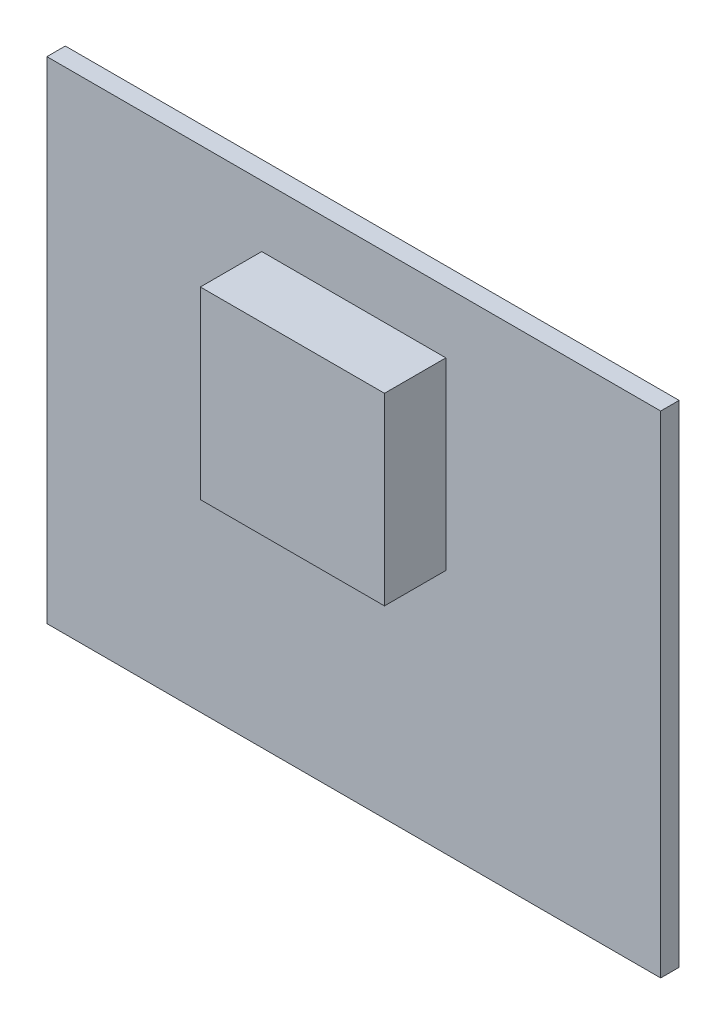
ISO-10303-21;
HEADER;
FILE_DESCRIPTION(('STEP AP214'),'2;1');
FILE_NAME('part.step','',(''),(''),'','','');
FILE_SCHEMA(('AUTOMOTIVE_DESIGN { 1 0 10303 214 1 1 1 1 }'));
ENDSEC;
DATA;
#1=APPLICATION_CONTEXT('core data for automotive mechanical design processes');
#2=APPLICATION_PROTOCOL_DEFINITION('international standard','automotive_design',2000,#1);
#3=PRODUCT_CONTEXT('',#1,'mechanical');
#4=PRODUCT('Part','Part','',(#3));
#5=PRODUCT_RELATED_PRODUCT_CATEGORY('part','',(#4));
#6=PRODUCT_DEFINITION_FORMATION('','',#4);
#7=PRODUCT_DEFINITION_CONTEXT('part definition',#1,'design');
#8=PRODUCT_DEFINITION('design','',#6,#7);
#9=PRODUCT_DEFINITION_SHAPE('','',#8);
#10=(LENGTH_UNIT() NAMED_UNIT(*) SI_UNIT(.MILLI.,.METRE.));
#11=(NAMED_UNIT(*) PLANE_ANGLE_UNIT() SI_UNIT($,.RADIAN.));
#12=(NAMED_UNIT(*) SI_UNIT($,.STERADIAN.) SOLID_ANGLE_UNIT());
#13=UNCERTAINTY_MEASURE_WITH_UNIT(LENGTH_MEASURE(1.E-05),#10,'distance_accuracy_value','');
#14=(GEOMETRIC_REPRESENTATION_CONTEXT(3) GLOBAL_UNCERTAINTY_ASSIGNED_CONTEXT((#13)) GLOBAL_UNIT_ASSIGNED_CONTEXT((#10,
#11,#12)) REPRESENTATION_CONTEXT('',''));
#15=CARTESIAN_POINT('',(0.,0.,0.));
#16=DIRECTION('',(0.,0.,1.));
#17=DIRECTION('',(1.,0.,0.));
#18=AXIS2_PLACEMENT_3D('',#15,#16,#17);
#19=CARTESIAN_POINT('',(50.,40.,3.));
#20=DIRECTION('',(-1.,0.,0.));
#21=DIRECTION('',(0.,-1.,0.));
#22=AXIS2_PLACEMENT_3D('',#19,#20,#21);
#23=PLANE('',#22);
#24=DIRECTION('',(0.,1.,0.));
#25=VECTOR('',#24,1.);
#26=CARTESIAN_POINT('',(50.,40.,0.));
#27=LINE('',#26,#25);
#28=CARTESIAN_POINT('',(50.,-40.,0.));
#29=VERTEX_POINT('',#28);
#30=CARTESIAN_POINT('',(50.,40.,0.));
#31=VERTEX_POINT('',#30);
#32=EDGE_CURVE('E118',#29,#31,#27,.T.);
#33=ORIENTED_EDGE('',*,*,#32,.T.);
#34=DIRECTION('',(0.,0.,-1.));
#35=VECTOR('',#34,1.);
#36=CARTESIAN_POINT('',(50.,40.,3.));
#37=LINE('',#36,#35);
#38=CARTESIAN_POINT('',(50.,40.,3.));
#39=VERTEX_POINT('',#38);
#40=EDGE_CURVE('E11',#39,#31,#37,.T.);
#41=ORIENTED_EDGE('',*,*,#40,.F.);
#42=DIRECTION('',(0.,1.,0.));
#43=VECTOR('',#42,1.);
#44=CARTESIAN_POINT('',(50.,40.,3.));
#45=LINE('',#44,#43);
#46=CARTESIAN_POINT('',(50.,-40.,3.));
#47=VERTEX_POINT('',#46);
#48=EDGE_CURVE('E127',#47,#39,#45,.T.);
#49=ORIENTED_EDGE('',*,*,#48,.F.);
#50=DIRECTION('',(0.,0.,-1.));
#51=VECTOR('',#50,1.);
#52=CARTESIAN_POINT('',(50.,-40.,3.));
#53=LINE('',#52,#51);
#54=EDGE_CURVE('E136',#47,#29,#53,.T.);
#55=ORIENTED_EDGE('',*,*,#54,.T.);
#56=EDGE_LOOP('',(#33,#41,#49,#55));
#57=FACE_BOUND('',#56,.T.);
#58=ADVANCED_FACE('F34',(#57),#23,.F.);
#59=CARTESIAN_POINT('',(-50.,40.,3.));
#60=DIRECTION('',(0.,-1.,0.));
#61=DIRECTION('',(0.,0.,-1.));
#62=AXIS2_PLACEMENT_3D('',#59,#60,#61);
#63=PLANE('',#62);
#64=DIRECTION('',(-1.,0.,0.));
#65=VECTOR('',#64,1.);
#66=CARTESIAN_POINT('',(-50.,40.,0.));
#67=LINE('',#66,#65);
#68=CARTESIAN_POINT('',(-50.,40.,0.));
#69=VERTEX_POINT('',#68);
#70=EDGE_CURVE('E121',#31,#69,#67,.T.);
#71=ORIENTED_EDGE('',*,*,#70,.T.);
#72=DIRECTION('',(0.,0.,-1.));
#73=VECTOR('',#72,1.);
#74=CARTESIAN_POINT('',(-50.,40.,3.));
#75=LINE('',#74,#73);
#76=CARTESIAN_POINT('',(-50.,40.,3.));
#77=VERTEX_POINT('',#76);
#78=EDGE_CURVE('E41',#77,#69,#75,.T.);
#79=ORIENTED_EDGE('',*,*,#78,.F.);
#80=DIRECTION('',(-1.,0.,0.));
#81=VECTOR('',#80,1.);
#82=CARTESIAN_POINT('',(-50.,40.,3.));
#83=LINE('',#82,#81);
#84=EDGE_CURVE('E130',#39,#77,#83,.T.);
#85=ORIENTED_EDGE('',*,*,#84,.F.);
#86=ORIENTED_EDGE('',*,*,#40,.T.);
#87=EDGE_LOOP('',(#71,#79,#85,#86));
#88=FACE_BOUND('',#87,.T.);
#89=ADVANCED_FACE('F167',(#88),#63,.F.);
#90=CARTESIAN_POINT('',(-50.,40.,3.));
#91=DIRECTION('',(1.,0.,0.));
#92=DIRECTION('',(0.,1.,0.));
#93=AXIS2_PLACEMENT_3D('',#90,#91,#92);
#94=PLANE('',#93);
#95=DIRECTION('',(0.,-1.,0.));
#96=VECTOR('',#95,1.);
#97=CARTESIAN_POINT('',(-50.,40.,0.));
#98=LINE('',#97,#96);
#99=CARTESIAN_POINT('',(-50.,-40.,0.));
#100=VERTEX_POINT('',#99);
#101=EDGE_CURVE('E139',#69,#100,#98,.T.);
#102=ORIENTED_EDGE('',*,*,#101,.T.);
#103=DIRECTION('',(0.,0.,-1.));
#104=VECTOR('',#103,1.);
#105=CARTESIAN_POINT('',(-50.,-40.,3.));
#106=LINE('',#105,#104);
#107=CARTESIAN_POINT('',(-50.,-40.,3.));
#108=VERTEX_POINT('',#107);
#109=EDGE_CURVE('E144',#108,#100,#106,.T.);
#110=ORIENTED_EDGE('',*,*,#109,.F.);
#111=DIRECTION('',(0.,-1.,0.));
#112=VECTOR('',#111,1.);
#113=CARTESIAN_POINT('',(-50.,40.,3.));
#114=LINE('',#113,#112);
#115=EDGE_CURVE('E133',#77,#108,#114,.T.);
#116=ORIENTED_EDGE('',*,*,#115,.F.);
#117=ORIENTED_EDGE('',*,*,#78,.T.);
#118=EDGE_LOOP('',(#102,#110,#116,#117));
#119=FACE_BOUND('',#118,.T.);
#120=ADVANCED_FACE('F151',(#119),#94,.F.);
#121=CARTESIAN_POINT('',(-50.,-40.,3.));
#122=DIRECTION('',(0.,1.,0.));
#123=DIRECTION('',(0.,0.,1.));
#124=AXIS2_PLACEMENT_3D('',#121,#122,#123);
#125=PLANE('',#124);
#126=DIRECTION('',(1.,0.,0.));
#127=VECTOR('',#126,1.);
#128=CARTESIAN_POINT('',(-50.,-40.,0.));
#129=LINE('',#128,#127);
#130=EDGE_CURVE('E131',#100,#29,#129,.T.);
#131=ORIENTED_EDGE('',*,*,#130,.T.);
#132=ORIENTED_EDGE('',*,*,#54,.F.);
#133=DIRECTION('',(1.,0.,0.));
#134=VECTOR('',#133,1.);
#135=CARTESIAN_POINT('',(-50.,-40.,3.));
#136=LINE('',#135,#134);
#137=EDGE_CURVE('E135',#108,#47,#136,.T.);
#138=ORIENTED_EDGE('',*,*,#137,.F.);
#139=ORIENTED_EDGE('',*,*,#109,.T.);
#140=EDGE_LOOP('',(#131,#132,#138,#139));
#141=FACE_BOUND('',#140,.T.);
#142=ADVANCED_FACE('F160',(#141),#125,.F.);
#143=CARTESIAN_POINT('',(0.,0.,3.));
#144=DIRECTION('',(0.,0.,1.));
#145=DIRECTION('',(1.,0.,0.));
#146=AXIS2_PLACEMENT_3D('',#143,#144,#145);
#147=PLANE('',#146);
#148=DIRECTION('',(0.,1.,0.));
#149=VECTOR('',#148,1.);
#150=CARTESIAN_POINT('',(15.,30.,3.));
#151=LINE('',#150,#149);
#152=CARTESIAN_POINT('',(15.,0.,3.));
#153=VERTEX_POINT('',#152);
#154=CARTESIAN_POINT('',(15.,30.,3.));
#155=VERTEX_POINT('',#154);
#156=EDGE_CURVE('E48',#153,#155,#151,.T.);
#157=ORIENTED_EDGE('',*,*,#156,.F.);
#158=DIRECTION('',(1.,0.,0.));
#159=VECTOR('',#158,1.);
#160=CARTESIAN_POINT('',(-15.,0.,3.));
#161=LINE('',#160,#159);
#162=CARTESIAN_POINT('',(-15.,0.,3.));
#163=VERTEX_POINT('',#162);
#164=EDGE_CURVE('E52',#163,#153,#161,.T.);
#165=ORIENTED_EDGE('',*,*,#164,.F.);
#166=DIRECTION('',(0.,-1.,0.));
#167=VECTOR('',#166,1.);
#168=CARTESIAN_POINT('',(-15.,30.,3.));
#169=LINE('',#168,#167);
#170=CARTESIAN_POINT('',(-15.,30.,3.));
#171=VERTEX_POINT('',#170);
#172=EDGE_CURVE('E261',#171,#163,#169,.T.);
#173=ORIENTED_EDGE('',*,*,#172,.F.);
#174=DIRECTION('',(-1.,0.,0.));
#175=VECTOR('',#174,1.);
#176=CARTESIAN_POINT('',(-15.,30.,3.));
#177=LINE('',#176,#175);
#178=EDGE_CURVE('E267',#155,#171,#177,.T.);
#179=ORIENTED_EDGE('',*,*,#178,.F.);
#180=EDGE_LOOP('',(#157,#165,#173,#179));
#181=FACE_BOUND('',#180,.T.);
#182=ORIENTED_EDGE('',*,*,#48,.T.);
#183=ORIENTED_EDGE('',*,*,#84,.T.);
#184=ORIENTED_EDGE('',*,*,#115,.T.);
#185=ORIENTED_EDGE('',*,*,#137,.T.);
#186=EDGE_LOOP('',(#182,#183,#184,#185));
#187=FACE_BOUND('',#186,.T.);
#188=ADVANCED_FACE('F166',(#181,#187),#147,.T.);
#189=CARTESIAN_POINT('',(0.,0.,0.));
#190=DIRECTION('',(0.,0.,1.));
#191=DIRECTION('',(1.,0.,0.));
#192=AXIS2_PLACEMENT_3D('',#189,#190,#191);
#193=PLANE('',#192);
#194=ORIENTED_EDGE('',*,*,#32,.F.);
#195=ORIENTED_EDGE('',*,*,#130,.F.);
#196=ORIENTED_EDGE('',*,*,#101,.F.);
#197=ORIENTED_EDGE('',*,*,#70,.F.);
#198=EDGE_LOOP('',(#194,#195,#196,#197));
#199=FACE_BOUND('',#198,.T.);
#200=ADVANCED_FACE('F157',(#199),#193,.F.);
#201=CARTESIAN_POINT('',(15.,30.,13.));
#202=DIRECTION('',(-1.,0.,0.));
#203=DIRECTION('',(0.,-1.,0.));
#204=AXIS2_PLACEMENT_3D('',#201,#202,#203);
#205=PLANE('',#204);
#206=ORIENTED_EDGE('',*,*,#156,.T.);
#207=DIRECTION('',(0.,0.,-1.));
#208=VECTOR('',#207,1.);
#209=CARTESIAN_POINT('',(15.,30.,13.));
#210=LINE('',#209,#208);
#211=CARTESIAN_POINT('',(15.,30.,13.));
#212=VERTEX_POINT('',#211);
#213=EDGE_CURVE('E101',#212,#155,#210,.T.);
#214=ORIENTED_EDGE('',*,*,#213,.F.);
#215=DIRECTION('',(0.,1.,0.));
#216=VECTOR('',#215,1.);
#217=CARTESIAN_POINT('',(15.,30.,13.));
#218=LINE('',#217,#216);
#219=CARTESIAN_POINT('',(15.,0.,13.));
#220=VERTEX_POINT('',#219);
#221=EDGE_CURVE('E107',#220,#212,#218,.T.);
#222=ORIENTED_EDGE('',*,*,#221,.F.);
#223=DIRECTION('',(0.,0.,-1.));
#224=VECTOR('',#223,1.);
#225=CARTESIAN_POINT('',(15.,0.,13.));
#226=LINE('',#225,#224);
#227=EDGE_CURVE('E259',#220,#153,#226,.T.);
#228=ORIENTED_EDGE('',*,*,#227,.T.);
#229=EDGE_LOOP('',(#206,#214,#222,#228));
#230=FACE_BOUND('',#229,.T.);
#231=ADVANCED_FACE('F117',(#230),#205,.F.);
#232=CARTESIAN_POINT('',(-15.,30.,13.));
#233=DIRECTION('',(0.,-1.,0.));
#234=DIRECTION('',(0.,0.,-1.));
#235=AXIS2_PLACEMENT_3D('',#232,#233,#234);
#236=PLANE('',#235);
#237=ORIENTED_EDGE('',*,*,#178,.T.);
#238=DIRECTION('',(0.,0.,-1.));
#239=VECTOR('',#238,1.);
#240=CARTESIAN_POINT('',(-15.,30.,13.));
#241=LINE('',#240,#239);
#242=CARTESIAN_POINT('',(-15.,30.,13.));
#243=VERTEX_POINT('',#242);
#244=EDGE_CURVE('E103',#243,#171,#241,.T.);
#245=ORIENTED_EDGE('',*,*,#244,.F.);
#246=DIRECTION('',(-1.,0.,0.));
#247=VECTOR('',#246,1.);
#248=CARTESIAN_POINT('',(-15.,30.,13.));
#249=LINE('',#248,#247);
#250=EDGE_CURVE('E96',#212,#243,#249,.T.);
#251=ORIENTED_EDGE('',*,*,#250,.F.);
#252=ORIENTED_EDGE('',*,*,#213,.T.);
#253=EDGE_LOOP('',(#237,#245,#251,#252));
#254=FACE_BOUND('',#253,.T.);
#255=ADVANCED_FACE('F99',(#254),#236,.F.);
#256=CARTESIAN_POINT('',(-15.,30.,13.));
#257=DIRECTION('',(1.,0.,0.));
#258=DIRECTION('',(0.,1.,0.));
#259=AXIS2_PLACEMENT_3D('',#256,#257,#258);
#260=PLANE('',#259);
#261=ORIENTED_EDGE('',*,*,#172,.T.);
#262=DIRECTION('',(0.,0.,-1.));
#263=VECTOR('',#262,1.);
#264=CARTESIAN_POINT('',(-15.,0.,13.));
#265=LINE('',#264,#263);
#266=CARTESIAN_POINT('',(-15.,0.,13.));
#267=VERTEX_POINT('',#266);
#268=EDGE_CURVE('E123',#267,#163,#265,.T.);
#269=ORIENTED_EDGE('',*,*,#268,.F.);
#270=DIRECTION('',(0.,-1.,0.));
#271=VECTOR('',#270,1.);
#272=CARTESIAN_POINT('',(-15.,30.,13.));
#273=LINE('',#272,#271);
#274=EDGE_CURVE('E106',#243,#267,#273,.T.);
#275=ORIENTED_EDGE('',*,*,#274,.F.);
#276=ORIENTED_EDGE('',*,*,#244,.T.);
#277=EDGE_LOOP('',(#261,#269,#275,#276));
#278=FACE_BOUND('',#277,.T.);
#279=ADVANCED_FACE('F185',(#278),#260,.F.);
#280=CARTESIAN_POINT('',(-15.,0.,13.));
#281=DIRECTION('',(0.,1.,0.));
#282=DIRECTION('',(0.,0.,1.));
#283=AXIS2_PLACEMENT_3D('',#280,#281,#282);
#284=PLANE('',#283);
#285=ORIENTED_EDGE('',*,*,#164,.T.);
#286=ORIENTED_EDGE('',*,*,#227,.F.);
#287=DIRECTION('',(1.,0.,0.));
#288=VECTOR('',#287,1.);
#289=CARTESIAN_POINT('',(-15.,0.,13.));
#290=LINE('',#289,#288);
#291=EDGE_CURVE('E112',#267,#220,#290,.T.);
#292=ORIENTED_EDGE('',*,*,#291,.F.);
#293=ORIENTED_EDGE('',*,*,#268,.T.);
#294=EDGE_LOOP('',(#285,#286,#292,#293));
#295=FACE_BOUND('',#294,.T.);
#296=ADVANCED_FACE('F188',(#295),#284,.F.);
#297=CARTESIAN_POINT('',(0.,0.,13.));
#298=DIRECTION('',(0.,0.,1.));
#299=DIRECTION('',(1.,0.,0.));
#300=AXIS2_PLACEMENT_3D('',#297,#298,#299);
#301=PLANE('',#300);
#302=ORIENTED_EDGE('',*,*,#221,.T.);
#303=ORIENTED_EDGE('',*,*,#250,.T.);
#304=ORIENTED_EDGE('',*,*,#274,.T.);
#305=ORIENTED_EDGE('',*,*,#291,.T.);
#306=EDGE_LOOP('',(#302,#303,#304,#305));
#307=FACE_BOUND('',#306,.T.);
#308=ADVANCED_FACE('F110',(#307),#301,.T.);
#309=CLOSED_SHELL('',(#58,#89,#120,#142,#188,#200,#231,#255,#279,#296,#308));
#310=MANIFOLD_SOLID_BREP('B2',#309);
#311=ADVANCED_BREP_SHAPE_REPRESENTATION('',(#18,#310),#14);
#312=SHAPE_DEFINITION_REPRESENTATION(#9,#311);
ENDSEC;
END-ISO-10303-21;
